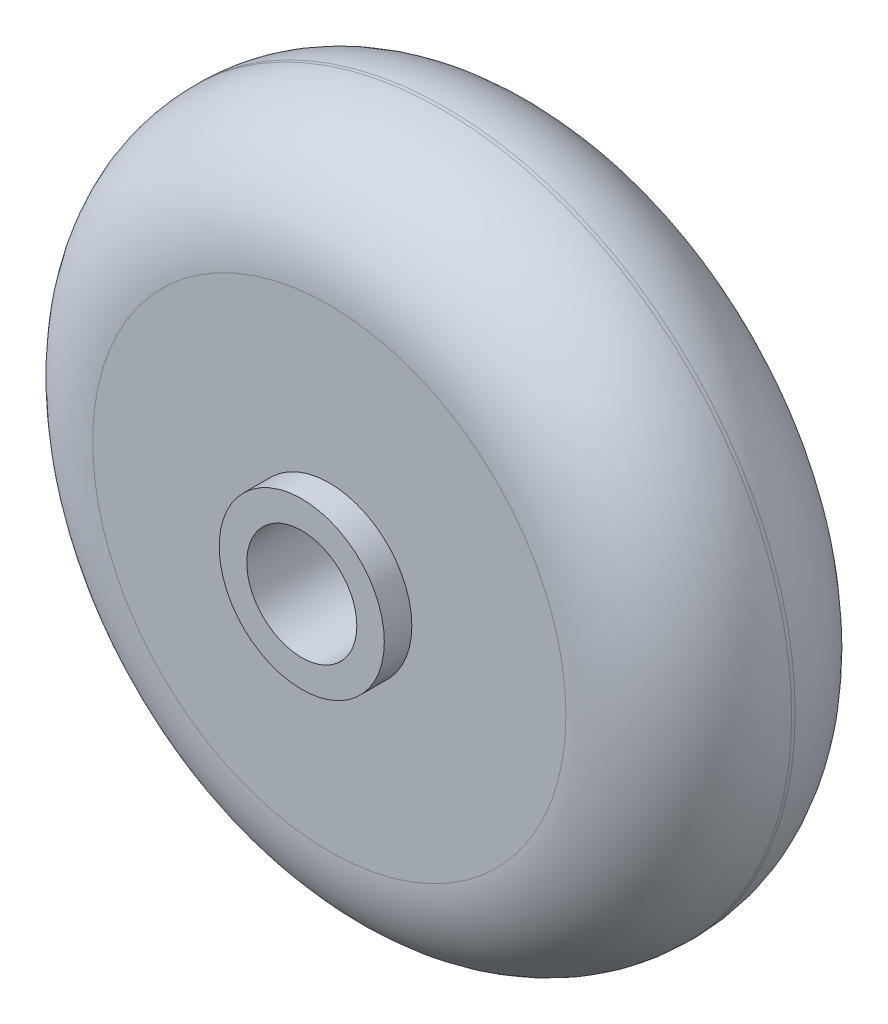
ISO-10303-21;
HEADER;
FILE_DESCRIPTION(('STEP AP214'),'2;1');
FILE_NAME('part.step','',(''),(''),'','','');
FILE_SCHEMA(('AUTOMOTIVE_DESIGN { 1 0 10303 214 1 1 1 1 }'));
ENDSEC;
DATA;
#1=APPLICATION_CONTEXT('core data for automotive mechanical design processes');
#2=APPLICATION_PROTOCOL_DEFINITION('international standard','automotive_design',2000,#1);
#3=PRODUCT_CONTEXT('',#1,'mechanical');
#4=PRODUCT('Part','Part','',(#3));
#5=PRODUCT_RELATED_PRODUCT_CATEGORY('part','',(#4));
#6=PRODUCT_DEFINITION_FORMATION('','',#4);
#7=PRODUCT_DEFINITION_CONTEXT('part definition',#1,'design');
#8=PRODUCT_DEFINITION('design','',#6,#7);
#9=PRODUCT_DEFINITION_SHAPE('','',#8);
#10=(LENGTH_UNIT() NAMED_UNIT(*) SI_UNIT(.MILLI.,.METRE.));
#11=(NAMED_UNIT(*) PLANE_ANGLE_UNIT() SI_UNIT($,.RADIAN.));
#12=(NAMED_UNIT(*) SI_UNIT($,.STERADIAN.) SOLID_ANGLE_UNIT());
#13=UNCERTAINTY_MEASURE_WITH_UNIT(LENGTH_MEASURE(1.E-05),#10,'distance_accuracy_value','');
#14=(GEOMETRIC_REPRESENTATION_CONTEXT(3) GLOBAL_UNCERTAINTY_ASSIGNED_CONTEXT((#13)) GLOBAL_UNIT_ASSIGNED_CONTEXT((#10,
#11,#12)) REPRESENTATION_CONTEXT('',''));
#15=CARTESIAN_POINT('',(0.,0.,0.));
#16=DIRECTION('',(0.,0.,1.));
#17=DIRECTION('',(1.,0.,0.));
#18=AXIS2_PLACEMENT_3D('',#15,#16,#17);
#19=CARTESIAN_POINT('',(0.,0.,16.66));
#20=DIRECTION('',(0.,0.,1.));
#21=DIRECTION('',(1.,0.,0.));
#22=AXIS2_PLACEMENT_3D('',#19,#20,#21);
#23=PLANE('',#22);
#24=CARTESIAN_POINT('',(0.,0.,16.66));
#25=DIRECTION('',(0.,0.,1.));
#26=DIRECTION('',(1.,0.,0.));
#27=AXIS2_PLACEMENT_3D('',#24,#25,#26);
#28=CIRCLE('',#27,17.2);
#29=CARTESIAN_POINT('',(17.2,0.,16.66));
#30=VERTEX_POINT('',#29);
#31=EDGE_CURVE('E11',#30,#30,#28,.T.);
#32=ORIENTED_EDGE('',*,*,#31,.T.);
#33=EDGE_LOOP('',(#32));
#34=FACE_BOUND('',#33,.T.);
#35=CARTESIAN_POINT('',(0.,0.,16.66));
#36=DIRECTION('',(0.,0.,1.));
#37=DIRECTION('',(1.,0.,0.));
#38=AXIS2_PLACEMENT_3D('',#35,#36,#37);
#39=CIRCLE('',#38,6.);
#40=CARTESIAN_POINT('',(6.,0.,16.66));
#41=VERTEX_POINT('',#40);
#42=EDGE_CURVE('E52',#41,#41,#39,.T.);
#43=ORIENTED_EDGE('',*,*,#42,.F.);
#44=EDGE_LOOP('',(#43));
#45=FACE_BOUND('',#44,.T.);
#46=ADVANCED_FACE('F32',(#34,#45),#23,.T.);
#47=CARTESIAN_POINT('',(0.,0.,0.));
#48=DIRECTION('',(0.,0.,1.));
#49=DIRECTION('',(1.,0.,0.));
#50=AXIS2_PLACEMENT_3D('',#47,#48,#49);
#51=PLANE('',#50);
#52=CARTESIAN_POINT('',(0.,0.,0.));
#53=DIRECTION('',(0.,0.,1.));
#54=DIRECTION('',(1.,0.,0.));
#55=AXIS2_PLACEMENT_3D('',#52,#53,#54);
#56=CIRCLE('',#55,17.2);
#57=CARTESIAN_POINT('',(17.2,0.,0.));
#58=VERTEX_POINT('',#57);
#59=EDGE_CURVE('E39',#58,#58,#56,.F.);
#60=ORIENTED_EDGE('',*,*,#59,.T.);
#61=EDGE_LOOP('',(#60));
#62=FACE_BOUND('',#61,.T.);
#63=CARTESIAN_POINT('',(0.,0.,0.));
#64=DIRECTION('',(0.,0.,1.));
#65=DIRECTION('',(1.,0.,0.));
#66=AXIS2_PLACEMENT_3D('',#63,#64,#65);
#67=CIRCLE('',#66,6.);
#68=CARTESIAN_POINT('',(6.,0.,0.));
#69=VERTEX_POINT('',#68);
#70=EDGE_CURVE('E53',#69,#69,#67,.T.);
#71=ORIENTED_EDGE('',*,*,#70,.T.);
#72=EDGE_LOOP('',(#71));
#73=FACE_BOUND('',#72,.T.);
#74=ADVANCED_FACE('F89',(#62,#73),#51,.F.);
#75=CARTESIAN_POINT('',(0.,0.,16.66));
#76=DIRECTION('',(0.,0.,-1.));
#77=DIRECTION('',(-1.,0.,0.));
#78=AXIS2_PLACEMENT_3D('',#75,#76,#77);
#79=CYLINDRICAL_SURFACE('',#78,25.4);
#80=CARTESIAN_POINT('',(0.,0.,8.2));
#81=DIRECTION('',(0.,0.,1.));
#82=DIRECTION('',(1.,0.,0.));
#83=AXIS2_PLACEMENT_3D('',#80,#81,#82);
#84=CIRCLE('',#83,25.4);
#85=CARTESIAN_POINT('',(25.4,0.,8.2));
#86=VERTEX_POINT('',#85);
#87=EDGE_CURVE('E43',#86,#86,#84,.T.);
#88=ORIENTED_EDGE('',*,*,#87,.T.);
#89=EDGE_LOOP('',(#88));
#90=FACE_BOUND('',#89,.T.);
#91=CARTESIAN_POINT('',(0.,0.,8.46));
#92=DIRECTION('',(0.,0.,1.));
#93=DIRECTION('',(1.,0.,0.));
#94=AXIS2_PLACEMENT_3D('',#91,#92,#93);
#95=CIRCLE('',#94,25.4);
#96=CARTESIAN_POINT('',(25.4,0.,8.46));
#97=VERTEX_POINT('',#96);
#98=EDGE_CURVE('E47',#97,#97,#95,.F.);
#99=ORIENTED_EDGE('',*,*,#98,.T.);
#100=EDGE_LOOP('',(#99));
#101=FACE_BOUND('',#100,.T.);
#102=ADVANCED_FACE('F94',(#90,#101),#79,.T.);
#103=CARTESIAN_POINT('',(0.,0.,-20.9705627484771));
#104=DIRECTION('',(0.,0.,1.));
#105=DIRECTION('',(1.,0.,0.));
#106=AXIS2_PLACEMENT_3D('',#103,#104,#105);
#107=CYLINDRICAL_SURFACE('',#106,6.);
#108=CARTESIAN_POINT('',(0.,0.,-2.));
#109=DIRECTION('',(0.,0.,1.));
#110=DIRECTION('',(1.,0.,0.));
#111=AXIS2_PLACEMENT_3D('',#108,#109,#110);
#112=CIRCLE('',#111,6.);
#113=CARTESIAN_POINT('',(6.,0.,-2.));
#114=VERTEX_POINT('',#113);
#115=EDGE_CURVE('E61',#114,#114,#112,.F.);
#116=ORIENTED_EDGE('',*,*,#115,.F.);
#117=EDGE_LOOP('',(#116));
#118=FACE_BOUND('',#117,.T.);
#119=ORIENTED_EDGE('',*,*,#70,.F.);
#120=EDGE_LOOP('',(#119));
#121=FACE_BOUND('',#120,.T.);
#122=ADVANCED_FACE('F86',(#118,#121),#107,.T.);
#123=CARTESIAN_POINT('',(0.,0.,-2.));
#124=DIRECTION('',(0.,0.,1.));
#125=DIRECTION('',(1.,0.,0.));
#126=AXIS2_PLACEMENT_3D('',#123,#124,#125);
#127=PLANE('',#126);
#128=ORIENTED_EDGE('',*,*,#115,.T.);
#129=EDGE_LOOP('',(#128));
#130=FACE_BOUND('',#129,.T.);
#131=CARTESIAN_POINT('',(0.,0.,-2.));
#132=DIRECTION('',(0.,0.,1.));
#133=DIRECTION('',(1.,0.,0.));
#134=AXIS2_PLACEMENT_3D('',#131,#132,#133);
#135=CIRCLE('',#134,4.);
#136=CARTESIAN_POINT('',(4.,0.,-2.));
#137=VERTEX_POINT('',#136);
#138=EDGE_CURVE('E56',#137,#137,#135,.F.);
#139=ORIENTED_EDGE('',*,*,#138,.F.);
#140=EDGE_LOOP('',(#139));
#141=FACE_BOUND('',#140,.T.);
#142=ADVANCED_FACE('F104',(#130,#141),#127,.F.);
#143=CARTESIAN_POINT('',(0.,0.,16.66));
#144=DIRECTION('',(0.,0.,-1.));
#145=DIRECTION('',(-1.,0.,0.));
#146=AXIS2_PLACEMENT_3D('',#143,#144,#145);
#147=CYLINDRICAL_SURFACE('',#146,4.);
#148=ORIENTED_EDGE('',*,*,#138,.T.);
#149=EDGE_LOOP('',(#148));
#150=FACE_BOUND('',#149,.T.);
#151=CARTESIAN_POINT('',(0.,0.,18.66));
#152=DIRECTION('',(0.,0.,1.));
#153=DIRECTION('',(1.,0.,0.));
#154=AXIS2_PLACEMENT_3D('',#151,#152,#153);
#155=CIRCLE('',#154,4.);
#156=CARTESIAN_POINT('',(4.,0.,18.66));
#157=VERTEX_POINT('',#156);
#158=EDGE_CURVE('E67',#157,#157,#155,.T.);
#159=ORIENTED_EDGE('',*,*,#158,.T.);
#160=EDGE_LOOP('',(#159));
#161=FACE_BOUND('',#160,.T.);
#162=ADVANCED_FACE('F71',(#150,#161),#147,.F.);
#163=ORIENTED_EDGE('',*,*,#42,.T.);
#164=EDGE_LOOP('',(#163));
#165=FACE_BOUND('',#164,.T.);
#166=CARTESIAN_POINT('',(0.,0.,18.66));
#167=DIRECTION('',(0.,0.,1.));
#168=DIRECTION('',(1.,0.,0.));
#169=AXIS2_PLACEMENT_3D('',#166,#167,#168);
#170=CIRCLE('',#169,6.);
#171=CARTESIAN_POINT('',(6.,0.,18.66));
#172=VERTEX_POINT('',#171);
#173=EDGE_CURVE('E64',#172,#172,#170,.T.);
#174=ORIENTED_EDGE('',*,*,#173,.F.);
#175=EDGE_LOOP('',(#174));
#176=FACE_BOUND('',#175,.T.);
#177=ADVANCED_FACE('F76',(#165,#176),#107,.T.);
#178=CARTESIAN_POINT('',(0.,0.,18.66));
#179=DIRECTION('',(0.,0.,1.));
#180=DIRECTION('',(1.,0.,0.));
#181=AXIS2_PLACEMENT_3D('',#178,#179,#180);
#182=PLANE('',#181);
#183=ORIENTED_EDGE('',*,*,#173,.T.);
#184=EDGE_LOOP('',(#183));
#185=FACE_BOUND('',#184,.T.);
#186=ORIENTED_EDGE('',*,*,#158,.F.);
#187=EDGE_LOOP('',(#186));
#188=FACE_BOUND('',#187,.T.);
#189=ADVANCED_FACE('F73',(#185,#188),#182,.T.);
#190=CARTESIAN_POINT('',(0.,0.,8.2));
#191=DIRECTION('',(0.,0.,1.));
#192=DIRECTION('',(1.,0.,0.));
#193=AXIS2_PLACEMENT_3D('',#190,#191,#192);
#194=TOROIDAL_SURFACE('',#193,17.2,8.2);
#195=ORIENTED_EDGE('',*,*,#59,.F.);
#196=EDGE_LOOP('',(#195));
#197=FACE_BOUND('',#196,.T.);
#198=ORIENTED_EDGE('',*,*,#87,.F.);
#199=EDGE_LOOP('',(#198));
#200=FACE_BOUND('',#199,.T.);
#201=ADVANCED_FACE('F75',(#197,#200),#194,.T.);
#202=CARTESIAN_POINT('',(0.,0.,8.46));
#203=DIRECTION('',(0.,0.,1.));
#204=DIRECTION('',(1.,0.,0.));
#205=AXIS2_PLACEMENT_3D('',#202,#203,#204);
#206=TOROIDAL_SURFACE('',#205,17.2,8.2);
#207=ORIENTED_EDGE('',*,*,#98,.F.);
#208=EDGE_LOOP('',(#207));
#209=FACE_BOUND('',#208,.T.);
#210=ORIENTED_EDGE('',*,*,#31,.F.);
#211=EDGE_LOOP('',(#210));
#212=FACE_BOUND('',#211,.T.);
#213=ADVANCED_FACE('F34',(#209,#212),#206,.T.);
#214=CLOSED_SHELL('',(#46,#74,#102,#122,#142,#162,#177,#189,#201,#213));
#215=MANIFOLD_SOLID_BREP('B2',#214);
#216=ADVANCED_BREP_SHAPE_REPRESENTATION('',(#18,#215),#14);
#217=SHAPE_DEFINITION_REPRESENTATION(#9,#216);
ENDSEC;
END-ISO-10303-21;
